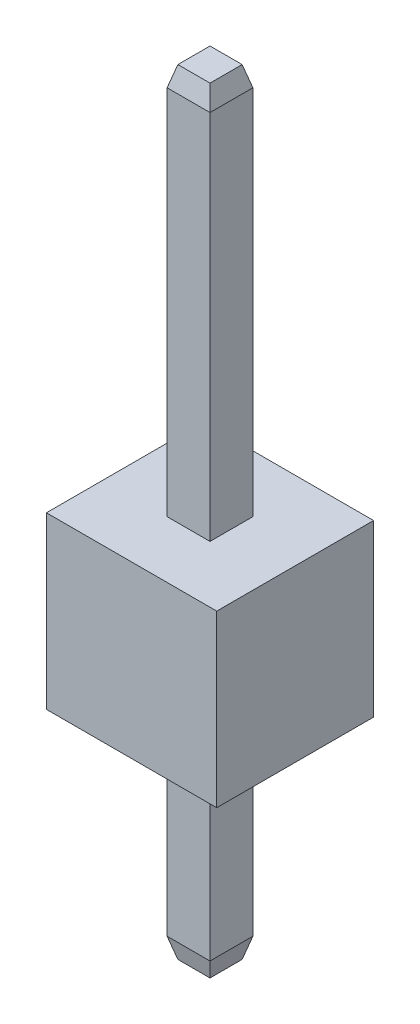
ISO-10303-21;
HEADER;
FILE_DESCRIPTION(('STEP AP214'),'2;1');
FILE_NAME('part.step','',(''),(''),'','','');
FILE_SCHEMA(('AUTOMOTIVE_DESIGN { 1 0 10303 214 1 1 1 1 }'));
ENDSEC;
DATA;
#1=APPLICATION_CONTEXT('core data for automotive mechanical design processes');
#2=APPLICATION_PROTOCOL_DEFINITION('international standard','automotive_design',2000,#1);
#3=PRODUCT_CONTEXT('',#1,'mechanical');
#4=PRODUCT('Part','Part','',(#3));
#5=PRODUCT_RELATED_PRODUCT_CATEGORY('part','',(#4));
#6=PRODUCT_DEFINITION_FORMATION('','',#4);
#7=PRODUCT_DEFINITION_CONTEXT('part definition',#1,'design');
#8=PRODUCT_DEFINITION('design','',#6,#7);
#9=PRODUCT_DEFINITION_SHAPE('','',#8);
#10=(LENGTH_UNIT() NAMED_UNIT(*) SI_UNIT(.MILLI.,.METRE.));
#11=(NAMED_UNIT(*) PLANE_ANGLE_UNIT() SI_UNIT($,.RADIAN.));
#12=(NAMED_UNIT(*) SI_UNIT($,.STERADIAN.) SOLID_ANGLE_UNIT());
#13=UNCERTAINTY_MEASURE_WITH_UNIT(LENGTH_MEASURE(1.E-05),#10,'distance_accuracy_value','');
#14=(GEOMETRIC_REPRESENTATION_CONTEXT(3) GLOBAL_UNCERTAINTY_ASSIGNED_CONTEXT((#13)) GLOBAL_UNIT_ASSIGNED_CONTEXT((#10,
#11,#12)) REPRESENTATION_CONTEXT('',''));
#15=CARTESIAN_POINT('',(0.,0.,0.));
#16=DIRECTION('',(0.,0.,1.));
#17=DIRECTION('',(1.,0.,0.));
#18=AXIS2_PLACEMENT_3D('',#15,#16,#17);
#19=CARTESIAN_POINT('',(0.32,8.38,-0.32));
#20=DIRECTION('',(-1.,0.,0.));
#21=DIRECTION('',(0.,0.,1.));
#22=AXIS2_PLACEMENT_3D('',#19,#20,#21);
#23=PLANE('',#22);
#24=DIRECTION('',(0.,-1.,0.));
#25=VECTOR('',#24,1.);
#26=CARTESIAN_POINT('',(0.32,8.38,-0.32));
#27=LINE('',#26,#25);
#28=CARTESIAN_POINT('',(0.32,8.08,-0.32));
#29=VERTEX_POINT('',#28);
#30=CARTESIAN_POINT('',(0.32,2.54,-0.32));
#31=VERTEX_POINT('',#30);
#32=EDGE_CURVE('E206',#29,#31,#27,.T.);
#33=ORIENTED_EDGE('',*,*,#32,.F.);
#34=DIRECTION('',(0.,0.,1.));
#35=VECTOR('',#34,1.);
#36=CARTESIAN_POINT('',(0.32,8.08,0.32));
#37=LINE('',#36,#35);
#38=CARTESIAN_POINT('',(0.32,8.08,0.32));
#39=VERTEX_POINT('',#38);
#40=EDGE_CURVE('E42',#29,#39,#37,.T.);
#41=ORIENTED_EDGE('',*,*,#40,.T.);
#42=DIRECTION('',(0.,-1.,0.));
#43=VECTOR('',#42,1.);
#44=CARTESIAN_POINT('',(0.32,8.38,0.32));
#45=LINE('',#44,#43);
#46=CARTESIAN_POINT('',(0.32,2.54,0.32));
#47=VERTEX_POINT('',#46);
#48=EDGE_CURVE('E197',#39,#47,#45,.T.);
#49=ORIENTED_EDGE('',*,*,#48,.T.);
#50=DIRECTION('',(0.,0.,-1.));
#51=VECTOR('',#50,1.);
#52=CARTESIAN_POINT('',(0.32,2.54,-0.32));
#53=LINE('',#52,#51);
#54=EDGE_CURVE('E193',#47,#31,#53,.T.);
#55=ORIENTED_EDGE('',*,*,#54,.T.);
#56=EDGE_LOOP('',(#33,#41,#49,#55));
#57=FACE_BOUND('',#56,.T.);
#58=ADVANCED_FACE('F33',(#57),#23,.F.);
#59=CARTESIAN_POINT('',(-0.32,8.38,-0.32));
#60=DIRECTION('',(0.,0.,1.));
#61=DIRECTION('',(1.,0.,0.));
#62=AXIS2_PLACEMENT_3D('',#59,#60,#61);
#63=PLANE('',#62);
#64=DIRECTION('',(0.,-1.,0.));
#65=VECTOR('',#64,1.);
#66=CARTESIAN_POINT('',(-0.32,8.38,-0.32));
#67=LINE('',#66,#65);
#68=CARTESIAN_POINT('',(-0.32,8.08,-0.32));
#69=VERTEX_POINT('',#68);
#70=CARTESIAN_POINT('',(-0.32,2.54,-0.32));
#71=VERTEX_POINT('',#70);
#72=EDGE_CURVE('E203',#69,#71,#67,.T.);
#73=ORIENTED_EDGE('',*,*,#72,.F.);
#74=DIRECTION('',(1.,0.,0.));
#75=VECTOR('',#74,1.);
#76=CARTESIAN_POINT('',(0.32,8.08,-0.32));
#77=LINE('',#76,#75);
#78=EDGE_CURVE('E57',#69,#29,#77,.T.);
#79=ORIENTED_EDGE('',*,*,#78,.T.);
#80=ORIENTED_EDGE('',*,*,#32,.T.);
#81=DIRECTION('',(-1.,0.,0.));
#82=VECTOR('',#81,1.);
#83=CARTESIAN_POINT('',(-0.32,2.54,-0.32));
#84=LINE('',#83,#82);
#85=EDGE_CURVE('E190',#31,#71,#84,.T.);
#86=ORIENTED_EDGE('',*,*,#85,.T.);
#87=EDGE_LOOP('',(#73,#79,#80,#86));
#88=FACE_BOUND('',#87,.T.);
#89=ADVANCED_FACE('F300',(#88),#63,.F.);
#90=CARTESIAN_POINT('',(-0.32,8.38,-0.32));
#91=DIRECTION('',(1.,0.,0.));
#92=DIRECTION('',(0.,0.,-1.));
#93=AXIS2_PLACEMENT_3D('',#90,#91,#92);
#94=PLANE('',#93);
#95=DIRECTION('',(0.,-1.,0.));
#96=VECTOR('',#95,1.);
#97=CARTESIAN_POINT('',(-0.32,8.38,0.32));
#98=LINE('',#97,#96);
#99=CARTESIAN_POINT('',(-0.32,8.08,0.32));
#100=VERTEX_POINT('',#99);
#101=CARTESIAN_POINT('',(-0.32,2.54,0.32));
#102=VERTEX_POINT('',#101);
#103=EDGE_CURVE('E200',#100,#102,#98,.T.);
#104=ORIENTED_EDGE('',*,*,#103,.F.);
#105=DIRECTION('',(0.,0.,-1.));
#106=VECTOR('',#105,1.);
#107=CARTESIAN_POINT('',(-0.32,8.08,-0.32));
#108=LINE('',#107,#106);
#109=EDGE_CURVE('E241',#100,#69,#108,.T.);
#110=ORIENTED_EDGE('',*,*,#109,.T.);
#111=ORIENTED_EDGE('',*,*,#72,.T.);
#112=DIRECTION('',(0.,0.,1.));
#113=VECTOR('',#112,1.);
#114=CARTESIAN_POINT('',(-0.32,2.54,-0.32));
#115=LINE('',#114,#113);
#116=EDGE_CURVE('E187',#71,#102,#115,.T.);
#117=ORIENTED_EDGE('',*,*,#116,.T.);
#118=EDGE_LOOP('',(#104,#110,#111,#117));
#119=FACE_BOUND('',#118,.T.);
#120=ADVANCED_FACE('F281',(#119),#94,.F.);
#121=CARTESIAN_POINT('',(-0.32,8.38,0.32));
#122=DIRECTION('',(0.,0.,-1.));
#123=DIRECTION('',(-1.,0.,0.));
#124=AXIS2_PLACEMENT_3D('',#121,#122,#123);
#125=PLANE('',#124);
#126=ORIENTED_EDGE('',*,*,#48,.F.);
#127=DIRECTION('',(-1.,0.,0.));
#128=VECTOR('',#127,1.);
#129=CARTESIAN_POINT('',(-0.32,8.08,0.32));
#130=LINE('',#129,#128);
#131=EDGE_CURVE('E11',#39,#100,#130,.T.);
#132=ORIENTED_EDGE('',*,*,#131,.T.);
#133=ORIENTED_EDGE('',*,*,#103,.T.);
#134=DIRECTION('',(1.,0.,0.));
#135=VECTOR('',#134,1.);
#136=CARTESIAN_POINT('',(-0.32,2.54,0.32));
#137=LINE('',#136,#135);
#138=EDGE_CURVE('E211',#102,#47,#137,.T.);
#139=ORIENTED_EDGE('',*,*,#138,.T.);
#140=EDGE_LOOP('',(#126,#132,#133,#139));
#141=FACE_BOUND('',#140,.T.);
#142=ADVANCED_FACE('F277',(#141),#125,.F.);
#143=CARTESIAN_POINT('',(0.,8.38,0.));
#144=DIRECTION('',(0.,1.,0.));
#145=DIRECTION('',(0.,0.,1.));
#146=AXIS2_PLACEMENT_3D('',#143,#144,#145);
#147=PLANE('',#146);
#148=DIRECTION('',(-1.,0.,0.));
#149=VECTOR('',#148,1.);
#150=CARTESIAN_POINT('',(-0.32,8.38,-0.239615242270664));
#151=LINE('',#150,#149);
#152=CARTESIAN_POINT('',(0.239615242270664,8.38,-0.239615242270664));
#153=VERTEX_POINT('',#152);
#154=CARTESIAN_POINT('',(-0.239615242270664,8.38,-0.239615242270664));
#155=VERTEX_POINT('',#154);
#156=EDGE_CURVE('E236',#153,#155,#151,.T.);
#157=ORIENTED_EDGE('',*,*,#156,.T.);
#158=DIRECTION('',(0.,0.,1.));
#159=VECTOR('',#158,1.);
#160=CARTESIAN_POINT('',(-0.239615242270663,8.38,0.32));
#161=LINE('',#160,#159);
#162=CARTESIAN_POINT('',(-0.239615242270664,8.38,0.239615242270663));
#163=VERTEX_POINT('',#162);
#164=EDGE_CURVE('E238',#155,#163,#161,.T.);
#165=ORIENTED_EDGE('',*,*,#164,.T.);
#166=DIRECTION('',(1.,0.,0.));
#167=VECTOR('',#166,1.);
#168=CARTESIAN_POINT('',(0.32,8.38,0.239615242270663));
#169=LINE('',#168,#167);
#170=CARTESIAN_POINT('',(0.239615242270664,8.38,0.239615242270663));
#171=VERTEX_POINT('',#170);
#172=EDGE_CURVE('E232',#163,#171,#169,.T.);
#173=ORIENTED_EDGE('',*,*,#172,.T.);
#174=DIRECTION('',(0.,0.,-1.));
#175=VECTOR('',#174,1.);
#176=CARTESIAN_POINT('',(0.239615242270664,8.38,-0.32));
#177=LINE('',#176,#175);
#178=EDGE_CURVE('E234',#171,#153,#177,.T.);
#179=ORIENTED_EDGE('',*,*,#178,.T.);
#180=EDGE_LOOP('',(#157,#165,#173,#179));
#181=FACE_BOUND('',#180,.T.);
#182=ADVANCED_FACE('F287',(#181),#147,.T.);
#183=CARTESIAN_POINT('',(0.,2.54,0.));
#184=DIRECTION('',(0.,1.,0.));
#185=DIRECTION('',(0.,0.,1.));
#186=AXIS2_PLACEMENT_3D('',#183,#184,#185);
#187=PLANE('',#186);
#188=DIRECTION('',(0.,0.,-1.));
#189=VECTOR('',#188,1.);
#190=CARTESIAN_POINT('',(1.27,2.54,-1.17));
#191=LINE('',#190,#189);
#192=CARTESIAN_POINT('',(1.27,2.54,1.17));
#193=VERTEX_POINT('',#192);
#194=CARTESIAN_POINT('',(1.27,2.54,-1.17));
#195=VERTEX_POINT('',#194);
#196=EDGE_CURVE('E158',#193,#195,#191,.T.);
#197=ORIENTED_EDGE('',*,*,#196,.T.);
#198=DIRECTION('',(-1.,0.,0.));
#199=VECTOR('',#198,1.);
#200=CARTESIAN_POINT('',(-1.27,2.54,-1.17));
#201=LINE('',#200,#199);
#202=CARTESIAN_POINT('',(-1.27,2.54,-1.17));
#203=VERTEX_POINT('',#202);
#204=EDGE_CURVE('E147',#195,#203,#201,.T.);
#205=ORIENTED_EDGE('',*,*,#204,.T.);
#206=DIRECTION('',(0.,0.,1.));
#207=VECTOR('',#206,1.);
#208=CARTESIAN_POINT('',(-1.27,2.54,-1.17));
#209=LINE('',#208,#207);
#210=CARTESIAN_POINT('',(-1.27,2.54,1.17));
#211=VERTEX_POINT('',#210);
#212=EDGE_CURVE('E157',#203,#211,#209,.T.);
#213=ORIENTED_EDGE('',*,*,#212,.T.);
#214=DIRECTION('',(1.,0.,0.));
#215=VECTOR('',#214,1.);
#216=CARTESIAN_POINT('',(-1.27,2.54,1.17));
#217=LINE('',#216,#215);
#218=EDGE_CURVE('E164',#211,#193,#217,.T.);
#219=ORIENTED_EDGE('',*,*,#218,.T.);
#220=EDGE_LOOP('',(#197,#205,#213,#219));
#221=FACE_BOUND('',#220,.T.);
#222=ORIENTED_EDGE('',*,*,#54,.F.);
#223=ORIENTED_EDGE('',*,*,#138,.F.);
#224=ORIENTED_EDGE('',*,*,#116,.F.);
#225=ORIENTED_EDGE('',*,*,#85,.F.);
#226=EDGE_LOOP('',(#222,#223,#224,#225));
#227=FACE_BOUND('',#226,.T.);
#228=ADVANCED_FACE('F161',(#221,#227),#187,.T.);
#229=CARTESIAN_POINT('',(0.,0.,0.));
#230=DIRECTION('',(0.,1.,0.));
#231=DIRECTION('',(0.,0.,1.));
#232=AXIS2_PLACEMENT_3D('',#229,#230,#231);
#233=PLANE('',#232);
#234=DIRECTION('',(0.,0.,-1.));
#235=VECTOR('',#234,1.);
#236=CARTESIAN_POINT('',(1.27,0.,-1.17));
#237=LINE('',#236,#235);
#238=CARTESIAN_POINT('',(1.27,0.,1.17));
#239=VERTEX_POINT('',#238);
#240=CARTESIAN_POINT('',(1.27,0.,-1.17));
#241=VERTEX_POINT('',#240);
#242=EDGE_CURVE('E172',#239,#241,#237,.T.);
#243=ORIENTED_EDGE('',*,*,#242,.F.);
#244=DIRECTION('',(1.,0.,0.));
#245=VECTOR('',#244,1.);
#246=CARTESIAN_POINT('',(-1.27,0.,1.17));
#247=LINE('',#246,#245);
#248=CARTESIAN_POINT('',(-1.27,0.,1.17));
#249=VERTEX_POINT('',#248);
#250=EDGE_CURVE('E168',#249,#239,#247,.T.);
#251=ORIENTED_EDGE('',*,*,#250,.F.);
#252=DIRECTION('',(0.,0.,1.));
#253=VECTOR('',#252,1.);
#254=CARTESIAN_POINT('',(-1.27,0.,-1.17));
#255=LINE('',#254,#253);
#256=CARTESIAN_POINT('',(-1.27,0.,-1.17));
#257=VERTEX_POINT('',#256);
#258=EDGE_CURVE('E514',#257,#249,#255,.T.);
#259=ORIENTED_EDGE('',*,*,#258,.F.);
#260=DIRECTION('',(-1.,0.,0.));
#261=VECTOR('',#260,1.);
#262=CARTESIAN_POINT('',(-1.27,0.,-1.17));
#263=LINE('',#262,#261);
#264=EDGE_CURVE('E512',#241,#257,#263,.T.);
#265=ORIENTED_EDGE('',*,*,#264,.F.);
#266=EDGE_LOOP('',(#243,#251,#259,#265));
#267=FACE_BOUND('',#266,.T.);
#268=DIRECTION('',(1.,0.,0.));
#269=VECTOR('',#268,1.);
#270=CARTESIAN_POINT('',(-0.32,0.,0.32));
#271=LINE('',#270,#269);
#272=CARTESIAN_POINT('',(-0.32,0.,0.32));
#273=VERTEX_POINT('',#272);
#274=CARTESIAN_POINT('',(0.32,0.,0.32));
#275=VERTEX_POINT('',#274);
#276=EDGE_CURVE('E208',#273,#275,#271,.T.);
#277=ORIENTED_EDGE('',*,*,#276,.T.);
#278=DIRECTION('',(0.,0.,-1.));
#279=VECTOR('',#278,1.);
#280=CARTESIAN_POINT('',(0.32,0.,-0.32));
#281=LINE('',#280,#279);
#282=CARTESIAN_POINT('',(0.32,0.,-0.32));
#283=VERTEX_POINT('',#282);
#284=EDGE_CURVE('E184',#275,#283,#281,.T.);
#285=ORIENTED_EDGE('',*,*,#284,.T.);
#286=DIRECTION('',(-1.,0.,0.));
#287=VECTOR('',#286,1.);
#288=CARTESIAN_POINT('',(-0.32,0.,-0.32));
#289=LINE('',#288,#287);
#290=CARTESIAN_POINT('',(-0.32,0.,-0.32));
#291=VERTEX_POINT('',#290);
#292=EDGE_CURVE('E176',#283,#291,#289,.T.);
#293=ORIENTED_EDGE('',*,*,#292,.T.);
#294=DIRECTION('',(0.,0.,1.));
#295=VECTOR('',#294,1.);
#296=CARTESIAN_POINT('',(-0.32,0.,-0.32));
#297=LINE('',#296,#295);
#298=EDGE_CURVE('E173',#291,#273,#297,.T.);
#299=ORIENTED_EDGE('',*,*,#298,.T.);
#300=EDGE_LOOP('',(#277,#285,#293,#299));
#301=FACE_BOUND('',#300,.T.);
#302=ADVANCED_FACE('F294',(#267,#301),#233,.F.);
#303=CARTESIAN_POINT('',(1.27,2.54,-1.17));
#304=DIRECTION('',(-1.,0.,0.));
#305=DIRECTION('',(0.,0.,1.));
#306=AXIS2_PLACEMENT_3D('',#303,#304,#305);
#307=PLANE('',#306);
#308=ORIENTED_EDGE('',*,*,#242,.T.);
#309=DIRECTION('',(0.,-1.,0.));
#310=VECTOR('',#309,1.);
#311=CARTESIAN_POINT('',(1.27,2.54,-1.17));
#312=LINE('',#311,#310);
#313=EDGE_CURVE('E151',#195,#241,#312,.T.);
#314=ORIENTED_EDGE('',*,*,#313,.F.);
#315=ORIENTED_EDGE('',*,*,#196,.F.);
#316=DIRECTION('',(0.,-1.,0.));
#317=VECTOR('',#316,1.);
#318=CARTESIAN_POINT('',(1.27,2.54,1.17));
#319=LINE('',#318,#317);
#320=EDGE_CURVE('E521',#193,#239,#319,.T.);
#321=ORIENTED_EDGE('',*,*,#320,.T.);
#322=EDGE_LOOP('',(#308,#314,#315,#321));
#323=FACE_BOUND('',#322,.T.);
#324=ADVANCED_FACE('F170',(#323),#307,.F.);
#325=CARTESIAN_POINT('',(-1.27,2.54,-1.17));
#326=DIRECTION('',(0.,0.,1.));
#327=DIRECTION('',(1.,0.,0.));
#328=AXIS2_PLACEMENT_3D('',#325,#326,#327);
#329=PLANE('',#328);
#330=ORIENTED_EDGE('',*,*,#264,.T.);
#331=DIRECTION('',(0.,-1.,0.));
#332=VECTOR('',#331,1.);
#333=CARTESIAN_POINT('',(-1.27,2.54,-1.17));
#334=LINE('',#333,#332);
#335=EDGE_CURVE('E154',#203,#257,#334,.T.);
#336=ORIENTED_EDGE('',*,*,#335,.F.);
#337=ORIENTED_EDGE('',*,*,#204,.F.);
#338=ORIENTED_EDGE('',*,*,#313,.T.);
#339=EDGE_LOOP('',(#330,#336,#337,#338));
#340=FACE_BOUND('',#339,.T.);
#341=ADVANCED_FACE('F149',(#340),#329,.F.);
#342=CARTESIAN_POINT('',(-1.27,2.54,-1.17));
#343=DIRECTION('',(1.,0.,0.));
#344=DIRECTION('',(0.,0.,-1.));
#345=AXIS2_PLACEMENT_3D('',#342,#343,#344);
#346=PLANE('',#345);
#347=ORIENTED_EDGE('',*,*,#258,.T.);
#348=DIRECTION('',(0.,-1.,0.));
#349=VECTOR('',#348,1.);
#350=CARTESIAN_POINT('',(-1.27,2.54,1.17));
#351=LINE('',#350,#349);
#352=EDGE_CURVE('E178',#211,#249,#351,.T.);
#353=ORIENTED_EDGE('',*,*,#352,.F.);
#354=ORIENTED_EDGE('',*,*,#212,.F.);
#355=ORIENTED_EDGE('',*,*,#335,.T.);
#356=EDGE_LOOP('',(#347,#353,#354,#355));
#357=FACE_BOUND('',#356,.T.);
#358=ADVANCED_FACE('F467',(#357),#346,.F.);
#359=CARTESIAN_POINT('',(-1.27,2.54,1.17));
#360=DIRECTION('',(0.,0.,-1.));
#361=DIRECTION('',(-1.,0.,0.));
#362=AXIS2_PLACEMENT_3D('',#359,#360,#361);
#363=PLANE('',#362);
#364=ORIENTED_EDGE('',*,*,#250,.T.);
#365=ORIENTED_EDGE('',*,*,#320,.F.);
#366=ORIENTED_EDGE('',*,*,#218,.F.);
#367=ORIENTED_EDGE('',*,*,#352,.T.);
#368=EDGE_LOOP('',(#364,#365,#366,#367));
#369=FACE_BOUND('',#368,.T.);
#370=ADVANCED_FACE('F353',(#369),#363,.F.);
#371=CARTESIAN_POINT('',(0.,-3.18,0.));
#372=DIRECTION('',(0.,1.,0.));
#373=DIRECTION('',(0.,0.,1.));
#374=AXIS2_PLACEMENT_3D('',#371,#372,#373);
#375=PLANE('',#374);
#376=DIRECTION('',(0.,0.,-1.));
#377=VECTOR('',#376,1.);
#378=CARTESIAN_POINT('',(-0.239615242270664,-3.18,0.));
#379=LINE('',#378,#377);
#380=CARTESIAN_POINT('',(-0.239615242270664,-3.18,0.239615242270663));
#381=VERTEX_POINT('',#380);
#382=CARTESIAN_POINT('',(-0.239615242270664,-3.18,-0.239615242270664));
#383=VERTEX_POINT('',#382);
#384=EDGE_CURVE('E221',#381,#383,#379,.T.);
#385=ORIENTED_EDGE('',*,*,#384,.T.);
#386=DIRECTION('',(1.,0.,0.));
#387=VECTOR('',#386,1.);
#388=CARTESIAN_POINT('',(0.,-3.18,-0.239615242270664));
#389=LINE('',#388,#387);
#390=CARTESIAN_POINT('',(0.239615242270664,-3.18,-0.239615242270664));
#391=VERTEX_POINT('',#390);
#392=EDGE_CURVE('E223',#383,#391,#389,.T.);
#393=ORIENTED_EDGE('',*,*,#392,.T.);
#394=DIRECTION('',(0.,0.,1.));
#395=VECTOR('',#394,1.);
#396=CARTESIAN_POINT('',(0.239615242270664,-3.18,0.));
#397=LINE('',#396,#395);
#398=CARTESIAN_POINT('',(0.239615242270664,-3.18,0.239615242270663));
#399=VERTEX_POINT('',#398);
#400=EDGE_CURVE('E217',#391,#399,#397,.T.);
#401=ORIENTED_EDGE('',*,*,#400,.T.);
#402=DIRECTION('',(-1.,0.,0.));
#403=VECTOR('',#402,1.);
#404=CARTESIAN_POINT('',(0.,-3.18,0.239615242270663));
#405=LINE('',#404,#403);
#406=EDGE_CURVE('E219',#399,#381,#405,.T.);
#407=ORIENTED_EDGE('',*,*,#406,.T.);
#408=EDGE_LOOP('',(#385,#393,#401,#407));
#409=FACE_BOUND('',#408,.T.);
#410=ADVANCED_FACE('F347',(#409),#375,.F.);
#411=CARTESIAN_POINT('',(-0.32,-2.88,0.32));
#412=VERTEX_POINT('',#411);
#413=EDGE_CURVE('E199',#273,#412,#98,.T.);
#414=ORIENTED_EDGE('',*,*,#413,.T.);
#415=DIRECTION('',(1.,0.,0.));
#416=VECTOR('',#415,1.);
#417=CARTESIAN_POINT('',(-0.32,-2.88,0.32));
#418=LINE('',#417,#416);
#419=CARTESIAN_POINT('',(0.32,-2.88,0.32));
#420=VERTEX_POINT('',#419);
#421=EDGE_CURVE('E228',#412,#420,#418,.T.);
#422=ORIENTED_EDGE('',*,*,#421,.T.);
#423=EDGE_CURVE('E196',#275,#420,#45,.T.);
#424=ORIENTED_EDGE('',*,*,#423,.F.);
#425=ORIENTED_EDGE('',*,*,#276,.F.);
#426=EDGE_LOOP('',(#414,#422,#424,#425));
#427=FACE_BOUND('',#426,.T.);
#428=ADVANCED_FACE('F297',(#427),#125,.F.);
#429=CARTESIAN_POINT('',(-0.32,-2.88,-0.32));
#430=VERTEX_POINT('',#429);
#431=EDGE_CURVE('E202',#291,#430,#67,.T.);
#432=ORIENTED_EDGE('',*,*,#431,.T.);
#433=DIRECTION('',(0.,0.,1.));
#434=VECTOR('',#433,1.);
#435=CARTESIAN_POINT('',(-0.32,-2.88,-0.32));
#436=LINE('',#435,#434);
#437=EDGE_CURVE('E226',#430,#412,#436,.T.);
#438=ORIENTED_EDGE('',*,*,#437,.T.);
#439=ORIENTED_EDGE('',*,*,#413,.F.);
#440=ORIENTED_EDGE('',*,*,#298,.F.);
#441=EDGE_LOOP('',(#432,#438,#439,#440));
#442=FACE_BOUND('',#441,.T.);
#443=ADVANCED_FACE('F319',(#442),#94,.F.);
#444=CARTESIAN_POINT('',(0.32,-2.88,-0.32));
#445=VERTEX_POINT('',#444);
#446=EDGE_CURVE('E205',#283,#445,#27,.T.);
#447=ORIENTED_EDGE('',*,*,#446,.T.);
#448=DIRECTION('',(-1.,0.,0.));
#449=VECTOR('',#448,1.);
#450=CARTESIAN_POINT('',(-0.32,-2.88,-0.32));
#451=LINE('',#450,#449);
#452=EDGE_CURVE('E214',#445,#430,#451,.T.);
#453=ORIENTED_EDGE('',*,*,#452,.T.);
#454=ORIENTED_EDGE('',*,*,#431,.F.);
#455=ORIENTED_EDGE('',*,*,#292,.F.);
#456=EDGE_LOOP('',(#447,#453,#454,#455));
#457=FACE_BOUND('',#456,.T.);
#458=ADVANCED_FACE('F307',(#457),#63,.F.);
#459=ORIENTED_EDGE('',*,*,#423,.T.);
#460=DIRECTION('',(0.,0.,-1.));
#461=VECTOR('',#460,1.);
#462=CARTESIAN_POINT('',(0.32,-2.88,-0.32));
#463=LINE('',#462,#461);
#464=EDGE_CURVE('E230',#420,#445,#463,.T.);
#465=ORIENTED_EDGE('',*,*,#464,.T.);
#466=ORIENTED_EDGE('',*,*,#446,.F.);
#467=ORIENTED_EDGE('',*,*,#284,.F.);
#468=EDGE_LOOP('',(#459,#465,#466,#467));
#469=FACE_BOUND('',#468,.T.);
#470=ADVANCED_FACE('F302',(#469),#23,.F.);
#471=CARTESIAN_POINT('',(-0.32,-2.88,0.32));
#472=DIRECTION('',(0.,0.258819045102519,-0.965925826289069));
#473=DIRECTION('',(1.,0.,0.));
#474=AXIS2_PLACEMENT_3D('',#471,#472,#473);
#475=PLANE('',#474);
#476=DIRECTION('',(0.25056280708573,-0.93511312653103,-0.25056280708573));
#477=VECTOR('',#476,1.);
#478=CARTESIAN_POINT('',(-0.32,-2.88,0.32));
#479=LINE('',#478,#477);
#480=EDGE_CURVE('E250',#381,#412,#479,.F.);
#481=ORIENTED_EDGE('',*,*,#480,.F.);
#482=ORIENTED_EDGE('',*,*,#406,.F.);
#483=DIRECTION('',(-0.25056280708573,-0.93511312653103,-0.25056280708573));
#484=VECTOR('',#483,1.);
#485=CARTESIAN_POINT('',(0.279819699011404,-3.02995492475285,0.279819699011404));
#486=LINE('',#485,#484);
#487=EDGE_CURVE('E253',#420,#399,#486,.T.);
#488=ORIENTED_EDGE('',*,*,#487,.F.);
#489=ORIENTED_EDGE('',*,*,#421,.F.);
#490=EDGE_LOOP('',(#481,#482,#488,#489));
#491=FACE_BOUND('',#490,.T.);
#492=ADVANCED_FACE('F310',(#491),#475,.F.);
#493=CARTESIAN_POINT('',(0.32,-2.88,-0.32));
#494=DIRECTION('',(-0.965925826289069,0.258819045102519,0.));
#495=DIRECTION('',(0.,0.,-1.));
#496=AXIS2_PLACEMENT_3D('',#493,#494,#495);
#497=PLANE('',#496);
#498=ORIENTED_EDGE('',*,*,#487,.T.);
#499=ORIENTED_EDGE('',*,*,#400,.F.);
#500=DIRECTION('',(0.25056280708573,0.93511312653103,-0.25056280708573));
#501=VECTOR('',#500,1.);
#502=CARTESIAN_POINT('',(0.32,-2.88,-0.32));
#503=LINE('',#502,#501);
#504=EDGE_CURVE('E248',#445,#391,#503,.F.);
#505=ORIENTED_EDGE('',*,*,#504,.F.);
#506=ORIENTED_EDGE('',*,*,#464,.F.);
#507=EDGE_LOOP('',(#498,#499,#505,#506));
#508=FACE_BOUND('',#507,.T.);
#509=ADVANCED_FACE('F316',(#508),#497,.F.);
#510=CARTESIAN_POINT('',(-0.32,-2.88,-0.32));
#511=DIRECTION('',(0.965925826289069,0.258819045102519,0.));
#512=DIRECTION('',(0.,0.,1.));
#513=AXIS2_PLACEMENT_3D('',#510,#511,#512);
#514=PLANE('',#513);
#515=ORIENTED_EDGE('',*,*,#480,.T.);
#516=ORIENTED_EDGE('',*,*,#437,.F.);
#517=DIRECTION('',(0.25056280708573,-0.93511312653103,0.25056280708573));
#518=VECTOR('',#517,1.);
#519=CARTESIAN_POINT('',(-0.32,-2.88,-0.32));
#520=LINE('',#519,#518);
#521=EDGE_CURVE('E246',#383,#430,#520,.F.);
#522=ORIENTED_EDGE('',*,*,#521,.F.);
#523=ORIENTED_EDGE('',*,*,#384,.F.);
#524=EDGE_LOOP('',(#515,#516,#522,#523));
#525=FACE_BOUND('',#524,.T.);
#526=ADVANCED_FACE('F412',(#525),#514,.F.);
#527=CARTESIAN_POINT('',(-0.32,-2.88,-0.32));
#528=DIRECTION('',(0.,0.258819045102519,0.965925826289069));
#529=DIRECTION('',(-1.,0.,0.));
#530=AXIS2_PLACEMENT_3D('',#527,#528,#529);
#531=PLANE('',#530);
#532=ORIENTED_EDGE('',*,*,#504,.T.);
#533=ORIENTED_EDGE('',*,*,#392,.F.);
#534=ORIENTED_EDGE('',*,*,#521,.T.);
#535=ORIENTED_EDGE('',*,*,#452,.F.);
#536=EDGE_LOOP('',(#532,#533,#534,#535));
#537=FACE_BOUND('',#536,.T.);
#538=ADVANCED_FACE('F337',(#537),#531,.F.);
#539=CARTESIAN_POINT('',(0.239615242270664,8.38,0.));
#540=DIRECTION('',(0.965925826289069,0.258819045102518,0.));
#541=DIRECTION('',(0.,0.,1.));
#542=AXIS2_PLACEMENT_3D('',#539,#540,#541);
#543=PLANE('',#542);
#544=DIRECTION('',(-0.250562807085729,0.935113126531031,-0.250562807085729));
#545=VECTOR('',#544,1.);
#546=CARTESIAN_POINT('',(0.224571785152085,8.43614294628802,0.224571785152085));
#547=LINE('',#546,#545);
#548=EDGE_CURVE('E259',#39,#171,#547,.T.);
#549=ORIENTED_EDGE('',*,*,#548,.F.);
#550=ORIENTED_EDGE('',*,*,#40,.F.);
#551=DIRECTION('',(-0.250562807085729,0.935113126531031,0.250562807085729));
#552=VECTOR('',#551,1.);
#553=CARTESIAN_POINT('',(0.224571785152085,8.43614294628802,-0.224571785152085));
#554=LINE('',#553,#552);
#555=EDGE_CURVE('E37',#153,#29,#554,.F.);
#556=ORIENTED_EDGE('',*,*,#555,.F.);
#557=ORIENTED_EDGE('',*,*,#178,.F.);
#558=EDGE_LOOP('',(#549,#550,#556,#557));
#559=FACE_BOUND('',#558,.T.);
#560=ADVANCED_FACE('F35',(#559),#543,.T.);
#561=CARTESIAN_POINT('',(0.,8.38,-0.239615242270664));
#562=DIRECTION('',(0.,0.258819045102518,-0.965925826289069));
#563=DIRECTION('',(1.,0.,0.));
#564=AXIS2_PLACEMENT_3D('',#561,#562,#563);
#565=PLANE('',#564);
#566=ORIENTED_EDGE('',*,*,#555,.T.);
#567=ORIENTED_EDGE('',*,*,#78,.F.);
#568=DIRECTION('',(0.250562807085729,0.935113126531031,0.250562807085729));
#569=VECTOR('',#568,1.);
#570=CARTESIAN_POINT('',(-0.224571785152085,8.43614294628802,-0.224571785152085));
#571=LINE('',#570,#569);
#572=EDGE_CURVE('E258',#155,#69,#571,.F.);
#573=ORIENTED_EDGE('',*,*,#572,.F.);
#574=ORIENTED_EDGE('',*,*,#156,.F.);
#575=EDGE_LOOP('',(#566,#567,#573,#574));
#576=FACE_BOUND('',#575,.T.);
#577=ADVANCED_FACE('F269',(#576),#565,.T.);
#578=CARTESIAN_POINT('',(0.,8.38,0.239615242270663));
#579=DIRECTION('',(0.,0.258819045102518,0.965925826289069));
#580=DIRECTION('',(-1.,0.,0.));
#581=AXIS2_PLACEMENT_3D('',#578,#579,#580);
#582=PLANE('',#581);
#583=ORIENTED_EDGE('',*,*,#548,.T.);
#584=ORIENTED_EDGE('',*,*,#172,.F.);
#585=DIRECTION('',(-0.250562807085729,-0.935113126531031,0.250562807085729));
#586=VECTOR('',#585,1.);
#587=CARTESIAN_POINT('',(-0.224571785152085,8.43614294628802,0.224571785152085));
#588=LINE('',#587,#586);
#589=EDGE_CURVE('E256',#100,#163,#588,.F.);
#590=ORIENTED_EDGE('',*,*,#589,.F.);
#591=ORIENTED_EDGE('',*,*,#131,.F.);
#592=EDGE_LOOP('',(#583,#584,#590,#591));
#593=FACE_BOUND('',#592,.T.);
#594=ADVANCED_FACE('F274',(#593),#582,.T.);
#595=CARTESIAN_POINT('',(-0.239615242270664,8.38,0.));
#596=DIRECTION('',(-0.965925826289069,0.258819045102518,0.));
#597=DIRECTION('',(0.,0.,-1.));
#598=AXIS2_PLACEMENT_3D('',#595,#596,#597);
#599=PLANE('',#598);
#600=ORIENTED_EDGE('',*,*,#572,.T.);
#601=ORIENTED_EDGE('',*,*,#109,.F.);
#602=ORIENTED_EDGE('',*,*,#589,.T.);
#603=ORIENTED_EDGE('',*,*,#164,.F.);
#604=EDGE_LOOP('',(#600,#601,#602,#603));
#605=FACE_BOUND('',#604,.T.);
#606=ADVANCED_FACE('F284',(#605),#599,.T.);
#607=CLOSED_SHELL('',(#58,#89,#120,#142,#182,#228,#302,#324,#341,#358,#370,#410,#428,#443,#458,
#470,#492,#509,#526,#538,#560,#577,#594,#606));
#608=MANIFOLD_SOLID_BREP('B2',#607);
#609=ADVANCED_BREP_SHAPE_REPRESENTATION('',(#18,#608),#14);
#610=SHAPE_DEFINITION_REPRESENTATION(#9,#609);
ENDSEC;
END-ISO-10303-21;
